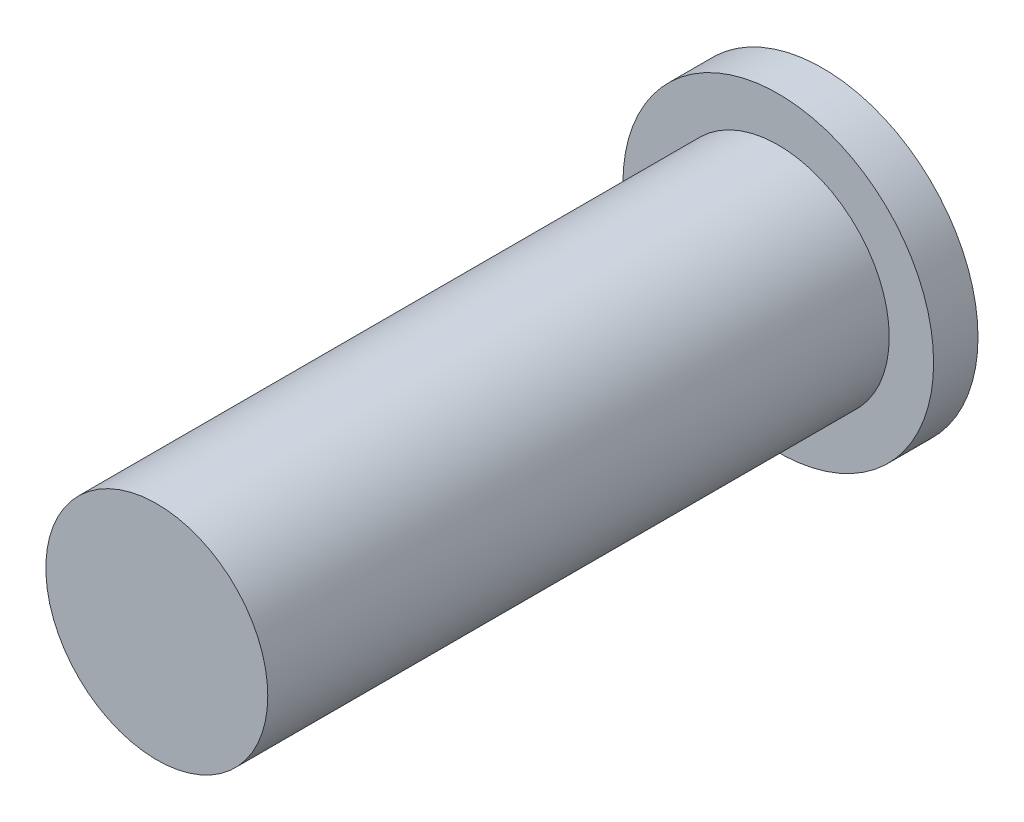
ISO-10303-21;
HEADER;
FILE_DESCRIPTION(('STEP AP214'),'2;1');
FILE_NAME('part.step','',(''),(''),'','','');
FILE_SCHEMA(('AUTOMOTIVE_DESIGN { 1 0 10303 214 1 1 1 1 }'));
ENDSEC;
DATA;
#1=APPLICATION_CONTEXT('core data for automotive mechanical design processes');
#2=APPLICATION_PROTOCOL_DEFINITION('international standard','automotive_design',2000,#1);
#3=PRODUCT_CONTEXT('',#1,'mechanical');
#4=PRODUCT('Part','Part','',(#3));
#5=PRODUCT_RELATED_PRODUCT_CATEGORY('part','',(#4));
#6=PRODUCT_DEFINITION_FORMATION('','',#4);
#7=PRODUCT_DEFINITION_CONTEXT('part definition',#1,'design');
#8=PRODUCT_DEFINITION('design','',#6,#7);
#9=PRODUCT_DEFINITION_SHAPE('','',#8);
#10=(LENGTH_UNIT() NAMED_UNIT(*) SI_UNIT(.MILLI.,.METRE.));
#11=(NAMED_UNIT(*) PLANE_ANGLE_UNIT() SI_UNIT($,.RADIAN.));
#12=(NAMED_UNIT(*) SI_UNIT($,.STERADIAN.) SOLID_ANGLE_UNIT());
#13=UNCERTAINTY_MEASURE_WITH_UNIT(LENGTH_MEASURE(1.E-05),#10,'distance_accuracy_value','');
#14=(GEOMETRIC_REPRESENTATION_CONTEXT(3) GLOBAL_UNCERTAINTY_ASSIGNED_CONTEXT((#13)) GLOBAL_UNIT_ASSIGNED_CONTEXT((#10,
#11,#12)) REPRESENTATION_CONTEXT('',''));
#15=CARTESIAN_POINT('',(0.,0.,0.));
#16=DIRECTION('',(0.,0.,1.));
#17=DIRECTION('',(1.,0.,0.));
#18=AXIS2_PLACEMENT_3D('',#15,#16,#17);
#19=CARTESIAN_POINT('',(0.,2.5,0.));
#20=DIRECTION('',(0.,0.,-1.));
#21=DIRECTION('',(-1.,0.,0.));
#22=AXIS2_PLACEMENT_3D('',#19,#20,#21);
#23=PLANE('',#22);
#24=CARTESIAN_POINT('',(0.,0.,0.));
#25=DIRECTION('',(0.,0.,1.));
#26=DIRECTION('',(1.,0.,0.));
#27=AXIS2_PLACEMENT_3D('',#24,#25,#26);
#28=CIRCLE('',#27,2.5);
#29=CARTESIAN_POINT('',(2.5,0.,0.));
#30=VERTEX_POINT('',#29);
#31=EDGE_CURVE('E10',#30,#30,#28,.T.);
#32=ORIENTED_EDGE('',*,*,#31,.T.);
#33=EDGE_LOOP('',(#32));
#34=FACE_BOUND('',#33,.T.);
#35=ADVANCED_FACE('F31',(#34),#23,.F.);
#36=CARTESIAN_POINT('',(0.,0.,0.));
#37=DIRECTION('',(0.,0.,1.));
#38=DIRECTION('',(1.,0.,0.));
#39=AXIS2_PLACEMENT_3D('',#36,#37,#38);
#40=CYLINDRICAL_SURFACE('',#39,2.5);
#41=ORIENTED_EDGE('',*,*,#31,.F.);
#42=EDGE_LOOP('',(#41));
#43=FACE_BOUND('',#42,.T.);
#44=CARTESIAN_POINT('',(0.,0.,-14.));
#45=DIRECTION('',(0.,0.,1.));
#46=DIRECTION('',(1.,0.,0.));
#47=AXIS2_PLACEMENT_3D('',#44,#45,#46);
#48=CIRCLE('',#47,2.5);
#49=CARTESIAN_POINT('',(2.5,0.,-14.));
#50=VERTEX_POINT('',#49);
#51=EDGE_CURVE('E37',#50,#50,#48,.T.);
#52=ORIENTED_EDGE('',*,*,#51,.T.);
#53=EDGE_LOOP('',(#52));
#54=FACE_BOUND('',#53,.T.);
#55=ADVANCED_FACE('F63',(#43,#54),#40,.T.);
#56=CARTESIAN_POINT('',(0.,2.5,-14.));
#57=DIRECTION('',(0.,0.,-1.));
#58=DIRECTION('',(-1.,0.,0.));
#59=AXIS2_PLACEMENT_3D('',#56,#57,#58);
#60=PLANE('',#59);
#61=ORIENTED_EDGE('',*,*,#51,.F.);
#62=EDGE_LOOP('',(#61));
#63=FACE_BOUND('',#62,.T.);
#64=CARTESIAN_POINT('',(0.,0.,-14.));
#65=DIRECTION('',(0.,0.,1.));
#66=DIRECTION('',(1.,0.,0.));
#67=AXIS2_PLACEMENT_3D('',#64,#65,#66);
#68=CIRCLE('',#67,3.5);
#69=CARTESIAN_POINT('',(3.5,0.,-14.));
#70=VERTEX_POINT('',#69);
#71=EDGE_CURVE('E41',#70,#70,#68,.T.);
#72=ORIENTED_EDGE('',*,*,#71,.T.);
#73=EDGE_LOOP('',(#72));
#74=FACE_BOUND('',#73,.T.);
#75=ADVANCED_FACE('F59',(#63,#74),#60,.F.);
#76=CARTESIAN_POINT('',(0.,0.,0.));
#77=DIRECTION('',(0.,0.,1.));
#78=DIRECTION('',(1.,0.,0.));
#79=AXIS2_PLACEMENT_3D('',#76,#77,#78);
#80=CYLINDRICAL_SURFACE('',#79,3.5);
#81=ORIENTED_EDGE('',*,*,#71,.F.);
#82=EDGE_LOOP('',(#81));
#83=FACE_BOUND('',#82,.T.);
#84=CARTESIAN_POINT('',(0.,0.,-15.));
#85=DIRECTION('',(0.,0.,1.));
#86=DIRECTION('',(1.,0.,0.));
#87=AXIS2_PLACEMENT_3D('',#84,#85,#86);
#88=CIRCLE('',#87,3.5);
#89=CARTESIAN_POINT('',(3.5,0.,-15.));
#90=VERTEX_POINT('',#89);
#91=EDGE_CURVE('E45',#90,#90,#88,.T.);
#92=ORIENTED_EDGE('',*,*,#91,.T.);
#93=EDGE_LOOP('',(#92));
#94=FACE_BOUND('',#93,.T.);
#95=ADVANCED_FACE('F51',(#83,#94),#80,.T.);
#96=CARTESIAN_POINT('',(0.,2.5,-15.));
#97=DIRECTION('',(0.,0.,1.));
#98=DIRECTION('',(1.,0.,0.));
#99=AXIS2_PLACEMENT_3D('',#96,#97,#98);
#100=PLANE('',#99);
#101=ORIENTED_EDGE('',*,*,#91,.F.);
#102=EDGE_LOOP('',(#101));
#103=FACE_BOUND('',#102,.T.);
#104=ADVANCED_FACE('F53',(#103),#100,.F.);
#105=CLOSED_SHELL('',(#35,#55,#75,#95,#104));
#106=MANIFOLD_SOLID_BREP('B2',#105);
#107=ADVANCED_BREP_SHAPE_REPRESENTATION('',(#18,#106),#14);
#108=SHAPE_DEFINITION_REPRESENTATION(#9,#107);
ENDSEC;
END-ISO-10303-21;
